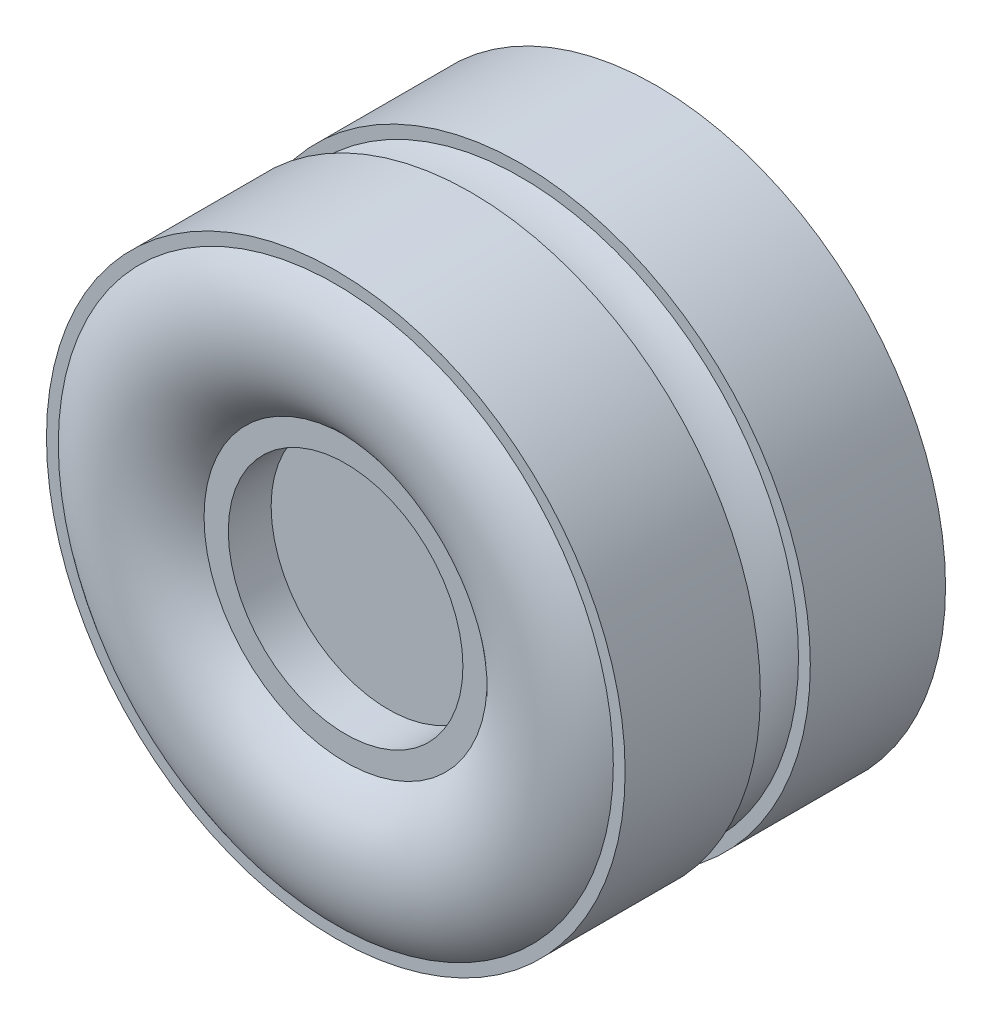
ISO-10303-21;
HEADER;
FILE_DESCRIPTION(('STEP AP214'),'2;1');
FILE_NAME('part.step','',(''),(''),'','','');
FILE_SCHEMA(('AUTOMOTIVE_DESIGN { 1 0 10303 214 1 1 1 1 }'));
ENDSEC;
DATA;
#1=APPLICATION_CONTEXT('core data for automotive mechanical design processes');
#2=APPLICATION_PROTOCOL_DEFINITION('international standard','automotive_design',2000,#1);
#3=PRODUCT_CONTEXT('',#1,'mechanical');
#4=PRODUCT('Part','Part','',(#3));
#5=PRODUCT_RELATED_PRODUCT_CATEGORY('part','',(#4));
#6=PRODUCT_DEFINITION_FORMATION('','',#4);
#7=PRODUCT_DEFINITION_CONTEXT('part definition',#1,'design');
#8=PRODUCT_DEFINITION('design','',#6,#7);
#9=PRODUCT_DEFINITION_SHAPE('','',#8);
#10=(LENGTH_UNIT() NAMED_UNIT(*) SI_UNIT(.MILLI.,.METRE.));
#11=(NAMED_UNIT(*) PLANE_ANGLE_UNIT() SI_UNIT($,.RADIAN.));
#12=(NAMED_UNIT(*) SI_UNIT($,.STERADIAN.) SOLID_ANGLE_UNIT());
#13=UNCERTAINTY_MEASURE_WITH_UNIT(LENGTH_MEASURE(1.E-05),#10,'distance_accuracy_value','');
#14=(GEOMETRIC_REPRESENTATION_CONTEXT(3) GLOBAL_UNCERTAINTY_ASSIGNED_CONTEXT((#13)) GLOBAL_UNIT_ASSIGNED_CONTEXT((#10,
#11,#12)) REPRESENTATION_CONTEXT('',''));
#15=CARTESIAN_POINT('',(0.,0.,0.));
#16=DIRECTION('',(0.,0.,1.));
#17=DIRECTION('',(1.,0.,0.));
#18=AXIS2_PLACEMENT_3D('',#15,#16,#17);
#19=CARTESIAN_POINT('',(0.,0.,-84.5961864311711));
#20=DIRECTION('',(0.,0.,-1.));
#21=DIRECTION('',(-1.,0.,0.));
#22=AXIS2_PLACEMENT_3D('',#19,#20,#21);
#23=TOROIDAL_SURFACE('',#22,94.1951945537992,43.0227364311711);
#24=CARTESIAN_POINT('',(0.,0.,-55.9087530309759));
#25=DIRECTION('',(0.,0.,-1.));
#26=DIRECTION('',(-1.,0.,0.));
#27=AXIS2_PLACEMENT_3D('',#24,#25,#26);
#28=CIRCLE('',#27,62.132957967195);
#29=CARTESIAN_POINT('',(-62.132957967195,0.,-55.9087530309759));
#30=VERTEX_POINT('',#29);
#31=EDGE_CURVE('E80',#30,#30,#28,.T.);
#32=ORIENTED_EDGE('',*,*,#31,.T.);
#33=EDGE_LOOP('',(#32));
#34=FACE_BOUND('',#33,.T.);
#35=CARTESIAN_POINT('',(0.,0.,-51.60645));
#36=DIRECTION('',(0.,0.,-1.));
#37=DIRECTION('',(-1.,0.,0.));
#38=AXIS2_PLACEMENT_3D('',#35,#36,#37);
#39=CIRCLE('',#38,121.811007781511);
#40=CARTESIAN_POINT('',(-121.811007781511,0.,-51.60645));
#41=VERTEX_POINT('',#40);
#42=EDGE_CURVE('E11',#41,#41,#39,.T.);
#43=ORIENTED_EDGE('',*,*,#42,.F.);
#44=EDGE_LOOP('',(#43));
#45=FACE_BOUND('',#44,.T.);
#46=ADVANCED_FACE('F46',(#34,#45),#23,.T.);
#47=CARTESIAN_POINT('',(0.,121.811007781511,-51.60645));
#48=DIRECTION('',(0.,0.,1.));
#49=DIRECTION('',(1.,0.,0.));
#50=AXIS2_PLACEMENT_3D('',#47,#48,#49);
#51=PLANE('',#50);
#52=ORIENTED_EDGE('',*,*,#42,.T.);
#53=EDGE_LOOP('',(#52));
#54=FACE_BOUND('',#53,.T.);
#55=CARTESIAN_POINT('',(0.,0.,-51.60645));
#56=DIRECTION('',(0.,0.,-1.));
#57=DIRECTION('',(-1.,0.,0.));
#58=AXIS2_PLACEMENT_3D('',#55,#56,#57);
#59=CIRCLE('',#58,127.);
#60=CARTESIAN_POINT('',(-127.,0.,-51.60645));
#61=VERTEX_POINT('',#60);
#62=EDGE_CURVE('E52',#61,#61,#59,.T.);
#63=ORIENTED_EDGE('',*,*,#62,.F.);
#64=EDGE_LOOP('',(#63));
#65=FACE_BOUND('',#64,.T.);
#66=ADVANCED_FACE('F98',(#54,#65),#51,.T.);
#67=CARTESIAN_POINT('',(0.,0.,-81.28));
#68=DIRECTION('',(0.,0.,-1.));
#69=DIRECTION('',(-1.,0.,0.));
#70=AXIS2_PLACEMENT_3D('',#67,#68,#69);
#71=CYLINDRICAL_SURFACE('',#70,127.);
#72=ORIENTED_EDGE('',*,*,#62,.T.);
#73=EDGE_LOOP('',(#72));
#74=FACE_BOUND('',#73,.T.);
#75=CARTESIAN_POINT('',(0.,0.,-110.95355));
#76=DIRECTION('',(0.,0.,-1.));
#77=DIRECTION('',(-1.,0.,0.));
#78=AXIS2_PLACEMENT_3D('',#75,#76,#77);
#79=CIRCLE('',#78,127.);
#80=CARTESIAN_POINT('',(-127.,0.,-110.95355));
#81=VERTEX_POINT('',#80);
#82=EDGE_CURVE('E56',#81,#81,#79,.T.);
#83=ORIENTED_EDGE('',*,*,#82,.F.);
#84=EDGE_LOOP('',(#83));
#85=FACE_BOUND('',#84,.T.);
#86=ADVANCED_FACE('F102',(#74,#85),#71,.T.);
#87=CARTESIAN_POINT('',(0.,127.,-110.95355));
#88=DIRECTION('',(0.,0.,-1.));
#89=DIRECTION('',(-1.,0.,0.));
#90=AXIS2_PLACEMENT_3D('',#87,#88,#89);
#91=PLANE('',#90);
#92=ORIENTED_EDGE('',*,*,#82,.T.);
#93=EDGE_LOOP('',(#92));
#94=FACE_BOUND('',#93,.T.);
#95=CARTESIAN_POINT('',(0.,0.,-110.95355));
#96=DIRECTION('',(0.,0.,-1.));
#97=DIRECTION('',(-1.,0.,0.));
#98=AXIS2_PLACEMENT_3D('',#95,#96,#97);
#99=CIRCLE('',#98,121.811007781511);
#100=CARTESIAN_POINT('',(-121.811007781511,0.,-110.95355));
#101=VERTEX_POINT('',#100);
#102=EDGE_CURVE('E60',#101,#101,#99,.T.);
#103=ORIENTED_EDGE('',*,*,#102,.F.);
#104=EDGE_LOOP('',(#103));
#105=FACE_BOUND('',#104,.T.);
#106=ADVANCED_FACE('F106',(#94,#105),#91,.T.);
#107=CARTESIAN_POINT('',(0.,0.,-77.963813568829));
#108=DIRECTION('',(0.,0.,-1.));
#109=DIRECTION('',(-1.,0.,0.));
#110=AXIS2_PLACEMENT_3D('',#107,#108,#109);
#111=TOROIDAL_SURFACE('',#110,94.1951945537992,43.0227364311711);
#112=ORIENTED_EDGE('',*,*,#102,.T.);
#113=EDGE_LOOP('',(#112));
#114=FACE_BOUND('',#113,.T.);
#115=CARTESIAN_POINT('',(0.,0.,-106.651246969024));
#116=DIRECTION('',(0.,0.,-1.));
#117=DIRECTION('',(-1.,0.,0.));
#118=AXIS2_PLACEMENT_3D('',#115,#116,#117);
#119=CIRCLE('',#118,62.132957967195);
#120=CARTESIAN_POINT('',(-62.132957967195,0.,-106.651246969024));
#121=VERTEX_POINT('',#120);
#122=EDGE_CURVE('E65',#121,#121,#119,.T.);
#123=ORIENTED_EDGE('',*,*,#122,.F.);
#124=EDGE_LOOP('',(#123));
#125=FACE_BOUND('',#124,.T.);
#126=ADVANCED_FACE('F112',(#114,#125),#111,.T.);
#127=CARTESIAN_POINT('',(0.,51.4886860347556,-106.651246969024));
#128=DIRECTION('',(0.,0.,-1.));
#129=DIRECTION('',(-1.,0.,0.));
#130=AXIS2_PLACEMENT_3D('',#127,#128,#129);
#131=PLANE('',#130);
#132=ORIENTED_EDGE('',*,*,#122,.T.);
#133=EDGE_LOOP('',(#132));
#134=FACE_BOUND('',#133,.T.);
#135=CARTESIAN_POINT('',(0.,0.,-106.651246969024));
#136=DIRECTION('',(0.,0.,-1.));
#137=DIRECTION('',(-1.,0.,0.));
#138=AXIS2_PLACEMENT_3D('',#135,#136,#137);
#139=CIRCLE('',#138,51.4886860347556);
#140=CARTESIAN_POINT('',(-51.4886860347556,0.,-106.651246969024));
#141=VERTEX_POINT('',#140);
#142=EDGE_CURVE('E68',#141,#141,#139,.T.);
#143=ORIENTED_EDGE('',*,*,#142,.F.);
#144=EDGE_LOOP('',(#143));
#145=FACE_BOUND('',#144,.T.);
#146=ADVANCED_FACE('F116',(#134,#145),#131,.T.);
#147=CARTESIAN_POINT('',(0.,0.,-81.28));
#148=DIRECTION('',(0.,0.,-1.));
#149=DIRECTION('',(-1.,0.,0.));
#150=AXIS2_PLACEMENT_3D('',#147,#148,#149);
#151=CYLINDRICAL_SURFACE('',#150,51.4886860347556);
#152=ORIENTED_EDGE('',*,*,#142,.T.);
#153=EDGE_LOOP('',(#152));
#154=FACE_BOUND('',#153,.T.);
#155=CARTESIAN_POINT('',(0.,0.,-88.2187004834596));
#156=DIRECTION('',(0.,0.,-1.));
#157=DIRECTION('',(-1.,0.,0.));
#158=AXIS2_PLACEMENT_3D('',#155,#156,#157);
#159=CIRCLE('',#158,51.4886860347556);
#160=CARTESIAN_POINT('',(-51.4886860347556,0.,-88.2187004834596));
#161=VERTEX_POINT('',#160);
#162=EDGE_CURVE('E71',#161,#161,#159,.T.);
#163=ORIENTED_EDGE('',*,*,#162,.F.);
#164=EDGE_LOOP('',(#163));
#165=FACE_BOUND('',#164,.T.);
#166=ADVANCED_FACE('F120',(#154,#165),#151,.F.);
#167=CARTESIAN_POINT('',(0.,0.,-88.2187004834596));
#168=DIRECTION('',(0.,0.,-1.));
#169=DIRECTION('',(-1.,0.,0.));
#170=AXIS2_PLACEMENT_3D('',#167,#168,#169);
#171=PLANE('',#170);
#172=ORIENTED_EDGE('',*,*,#162,.T.);
#173=EDGE_LOOP('',(#172));
#174=FACE_BOUND('',#173,.T.);
#175=ADVANCED_FACE('F124',(#174),#171,.T.);
#176=CARTESIAN_POINT('',(0.,51.4886860347556,-74.7145626672426));
#177=DIRECTION('',(0.,0.,1.));
#178=DIRECTION('',(1.,0.,0.));
#179=AXIS2_PLACEMENT_3D('',#176,#177,#178);
#180=PLANE('',#179);
#181=CARTESIAN_POINT('',(0.,0.,-74.714562667227));
#182=DIRECTION('',(0.,0.,-1.));
#183=DIRECTION('',(-1.,0.,0.));
#184=AXIS2_PLACEMENT_3D('',#181,#182,#183);
#185=CIRCLE('',#184,51.4886860347556);
#186=CARTESIAN_POINT('',(-51.4886860347556,0.,-74.714562667227));
#187=VERTEX_POINT('',#186);
#188=EDGE_CURVE('E74',#187,#187,#185,.T.);
#189=ORIENTED_EDGE('',*,*,#188,.F.);
#190=EDGE_LOOP('',(#189));
#191=FACE_BOUND('',#190,.T.);
#192=ADVANCED_FACE('F94',(#191),#180,.T.);
#193=CARTESIAN_POINT('',(0.,0.,-81.28));
#194=DIRECTION('',(0.,0.,-1.));
#195=DIRECTION('',(-1.,0.,0.));
#196=AXIS2_PLACEMENT_3D('',#193,#194,#195);
#197=CYLINDRICAL_SURFACE('',#196,51.4886860347556);
#198=ORIENTED_EDGE('',*,*,#188,.T.);
#199=EDGE_LOOP('',(#198));
#200=FACE_BOUND('',#199,.T.);
#201=CARTESIAN_POINT('',(0.,0.,-55.9087530309759));
#202=DIRECTION('',(0.,0.,-1.));
#203=DIRECTION('',(-1.,0.,0.));
#204=AXIS2_PLACEMENT_3D('',#201,#202,#203);
#205=CIRCLE('',#204,51.4886860347556);
#206=CARTESIAN_POINT('',(-51.4886860347556,0.,-55.9087530309759));
#207=VERTEX_POINT('',#206);
#208=EDGE_CURVE('E77',#207,#207,#205,.T.);
#209=ORIENTED_EDGE('',*,*,#208,.F.);
#210=EDGE_LOOP('',(#209));
#211=FACE_BOUND('',#210,.T.);
#212=ADVANCED_FACE('F88',(#200,#211),#197,.F.);
#213=CARTESIAN_POINT('',(0.,62.132957967195,-55.9087530309759));
#214=DIRECTION('',(0.,0.,1.));
#215=DIRECTION('',(1.,0.,0.));
#216=AXIS2_PLACEMENT_3D('',#213,#214,#215);
#217=PLANE('',#216);
#218=ORIENTED_EDGE('',*,*,#208,.T.);
#219=EDGE_LOOP('',(#218));
#220=FACE_BOUND('',#219,.T.);
#221=ORIENTED_EDGE('',*,*,#31,.F.);
#222=EDGE_LOOP('',(#221));
#223=FACE_BOUND('',#222,.T.);
#224=ADVANCED_FACE('F86',(#220,#223),#217,.T.);
#225=CLOSED_SHELL('',(#46,#66,#86,#106,#126,#146,#166,#175,#192,#212,#224));
#226=MANIFOLD_SOLID_BREP('B2',#225);
#227=CARTESIAN_POINT('',(0.,0.,-3.31618643117106));
#228=DIRECTION('',(0.,0.,-1.));
#229=DIRECTION('',(-1.,0.,0.));
#230=AXIS2_PLACEMENT_3D('',#227,#228,#229);
#231=TOROIDAL_SURFACE('',#230,94.1951945537992,43.0227364311711);
#232=CARTESIAN_POINT('',(0.,0.,25.3712469690241));
#233=DIRECTION('',(0.,0.,-1.));
#234=DIRECTION('',(-1.,0.,0.));
#235=AXIS2_PLACEMENT_3D('',#232,#233,#234);
#236=CIRCLE('',#235,62.132957967195);
#237=CARTESIAN_POINT('',(-62.132957967195,0.,25.3712469690241));
#238=VERTEX_POINT('',#237);
#239=EDGE_CURVE('E240',#238,#238,#236,.T.);
#240=ORIENTED_EDGE('',*,*,#239,.T.);
#241=EDGE_LOOP('',(#240));
#242=FACE_BOUND('',#241,.T.);
#243=CARTESIAN_POINT('',(0.,0.,29.67355));
#244=DIRECTION('',(0.,0.,-1.));
#245=DIRECTION('',(-1.,0.,0.));
#246=AXIS2_PLACEMENT_3D('',#243,#244,#245);
#247=CIRCLE('',#246,121.811007781511);
#248=CARTESIAN_POINT('',(-121.811007781511,0.,29.67355));
#249=VERTEX_POINT('',#248);
#250=EDGE_CURVE('E45',#249,#249,#247,.T.);
#251=ORIENTED_EDGE('',*,*,#250,.F.);
#252=EDGE_LOOP('',(#251));
#253=FACE_BOUND('',#252,.T.);
#254=ADVANCED_FACE('F206',(#242,#253),#231,.T.);
#255=CARTESIAN_POINT('',(0.,121.811007781511,29.67355));
#256=DIRECTION('',(0.,0.,1.));
#257=DIRECTION('',(1.,0.,0.));
#258=AXIS2_PLACEMENT_3D('',#255,#256,#257);
#259=PLANE('',#258);
#260=ORIENTED_EDGE('',*,*,#250,.T.);
#261=EDGE_LOOP('',(#260));
#262=FACE_BOUND('',#261,.T.);
#263=CARTESIAN_POINT('',(0.,0.,29.67355));
#264=DIRECTION('',(0.,0.,-1.));
#265=DIRECTION('',(-1.,0.,0.));
#266=AXIS2_PLACEMENT_3D('',#263,#264,#265);
#267=CIRCLE('',#266,127.);
#268=CARTESIAN_POINT('',(-127.,0.,29.67355));
#269=VERTEX_POINT('',#268);
#270=EDGE_CURVE('E212',#269,#269,#267,.T.);
#271=ORIENTED_EDGE('',*,*,#270,.F.);
#272=EDGE_LOOP('',(#271));
#273=FACE_BOUND('',#272,.T.);
#274=ADVANCED_FACE('F258',(#262,#273),#259,.T.);
#275=CARTESIAN_POINT('',(0.,0.,0.));
#276=DIRECTION('',(0.,0.,-1.));
#277=DIRECTION('',(-1.,0.,0.));
#278=AXIS2_PLACEMENT_3D('',#275,#276,#277);
#279=CYLINDRICAL_SURFACE('',#278,127.);
#280=ORIENTED_EDGE('',*,*,#270,.T.);
#281=EDGE_LOOP('',(#280));
#282=FACE_BOUND('',#281,.T.);
#283=CARTESIAN_POINT('',(0.,0.,-29.67355));
#284=DIRECTION('',(0.,0.,-1.));
#285=DIRECTION('',(-1.,0.,0.));
#286=AXIS2_PLACEMENT_3D('',#283,#284,#285);
#287=CIRCLE('',#286,127.);
#288=CARTESIAN_POINT('',(-127.,0.,-29.67355));
#289=VERTEX_POINT('',#288);
#290=EDGE_CURVE('E216',#289,#289,#287,.T.);
#291=ORIENTED_EDGE('',*,*,#290,.F.);
#292=EDGE_LOOP('',(#291));
#293=FACE_BOUND('',#292,.T.);
#294=ADVANCED_FACE('F262',(#282,#293),#279,.T.);
#295=CARTESIAN_POINT('',(0.,127.,-29.67355));
#296=DIRECTION('',(0.,0.,-1.));
#297=DIRECTION('',(-1.,0.,0.));
#298=AXIS2_PLACEMENT_3D('',#295,#296,#297);
#299=PLANE('',#298);
#300=ORIENTED_EDGE('',*,*,#290,.T.);
#301=EDGE_LOOP('',(#300));
#302=FACE_BOUND('',#301,.T.);
#303=CARTESIAN_POINT('',(0.,0.,-29.67355));
#304=DIRECTION('',(0.,0.,-1.));
#305=DIRECTION('',(-1.,0.,0.));
#306=AXIS2_PLACEMENT_3D('',#303,#304,#305);
#307=CIRCLE('',#306,121.811007781511);
#308=CARTESIAN_POINT('',(-121.811007781511,0.,-29.67355));
#309=VERTEX_POINT('',#308);
#310=EDGE_CURVE('E220',#309,#309,#307,.T.);
#311=ORIENTED_EDGE('',*,*,#310,.F.);
#312=EDGE_LOOP('',(#311));
#313=FACE_BOUND('',#312,.T.);
#314=ADVANCED_FACE('F266',(#302,#313),#299,.T.);
#315=CARTESIAN_POINT('',(0.,0.,3.31618643117106));
#316=DIRECTION('',(0.,0.,-1.));
#317=DIRECTION('',(-1.,0.,0.));
#318=AXIS2_PLACEMENT_3D('',#315,#316,#317);
#319=TOROIDAL_SURFACE('',#318,94.1951945537992,43.0227364311711);
#320=ORIENTED_EDGE('',*,*,#310,.T.);
#321=EDGE_LOOP('',(#320));
#322=FACE_BOUND('',#321,.T.);
#323=CARTESIAN_POINT('',(0.,0.,-25.3712469690241));
#324=DIRECTION('',(0.,0.,-1.));
#325=DIRECTION('',(-1.,0.,0.));
#326=AXIS2_PLACEMENT_3D('',#323,#324,#325);
#327=CIRCLE('',#326,62.132957967195);
#328=CARTESIAN_POINT('',(-62.132957967195,0.,-25.3712469690241));
#329=VERTEX_POINT('',#328);
#330=EDGE_CURVE('E225',#329,#329,#327,.T.);
#331=ORIENTED_EDGE('',*,*,#330,.F.);
#332=EDGE_LOOP('',(#331));
#333=FACE_BOUND('',#332,.T.);
#334=ADVANCED_FACE('F272',(#322,#333),#319,.T.);
#335=CARTESIAN_POINT('',(0.,51.4886860347556,-25.3712469690241));
#336=DIRECTION('',(0.,0.,-1.));
#337=DIRECTION('',(-1.,0.,0.));
#338=AXIS2_PLACEMENT_3D('',#335,#336,#337);
#339=PLANE('',#338);
#340=ORIENTED_EDGE('',*,*,#330,.T.);
#341=EDGE_LOOP('',(#340));
#342=FACE_BOUND('',#341,.T.);
#343=CARTESIAN_POINT('',(0.,0.,-25.3712469690241));
#344=DIRECTION('',(0.,0.,-1.));
#345=DIRECTION('',(-1.,0.,0.));
#346=AXIS2_PLACEMENT_3D('',#343,#344,#345);
#347=CIRCLE('',#346,51.4886860347556);
#348=CARTESIAN_POINT('',(-51.4886860347556,0.,-25.3712469690241));
#349=VERTEX_POINT('',#348);
#350=EDGE_CURVE('E228',#349,#349,#347,.T.);
#351=ORIENTED_EDGE('',*,*,#350,.F.);
#352=EDGE_LOOP('',(#351));
#353=FACE_BOUND('',#352,.T.);
#354=ADVANCED_FACE('F276',(#342,#353),#339,.T.);
#355=CARTESIAN_POINT('',(0.,0.,0.));
#356=DIRECTION('',(0.,0.,-1.));
#357=DIRECTION('',(-1.,0.,0.));
#358=AXIS2_PLACEMENT_3D('',#355,#356,#357);
#359=CYLINDRICAL_SURFACE('',#358,51.4886860347556);
#360=ORIENTED_EDGE('',*,*,#350,.T.);
#361=EDGE_LOOP('',(#360));
#362=FACE_BOUND('',#361,.T.);
#363=CARTESIAN_POINT('',(0.,0.,-6.93870048345957));
#364=DIRECTION('',(0.,0.,-1.));
#365=DIRECTION('',(-1.,0.,0.));
#366=AXIS2_PLACEMENT_3D('',#363,#364,#365);
#367=CIRCLE('',#366,51.4886860347556);
#368=CARTESIAN_POINT('',(-51.4886860347556,0.,-6.93870048345957));
#369=VERTEX_POINT('',#368);
#370=EDGE_CURVE('E231',#369,#369,#367,.T.);
#371=ORIENTED_EDGE('',*,*,#370,.F.);
#372=EDGE_LOOP('',(#371));
#373=FACE_BOUND('',#372,.T.);
#374=ADVANCED_FACE('F280',(#362,#373),#359,.F.);
#375=CARTESIAN_POINT('',(0.,0.,-6.93870048345957));
#376=DIRECTION('',(0.,0.,-1.));
#377=DIRECTION('',(-1.,0.,0.));
#378=AXIS2_PLACEMENT_3D('',#375,#376,#377);
#379=PLANE('',#378);
#380=ORIENTED_EDGE('',*,*,#370,.T.);
#381=EDGE_LOOP('',(#380));
#382=FACE_BOUND('',#381,.T.);
#383=ADVANCED_FACE('F284',(#382),#379,.T.);
#384=CARTESIAN_POINT('',(0.,51.4886860347556,6.56543733275741));
#385=DIRECTION('',(0.,0.,1.));
#386=DIRECTION('',(1.,0.,0.));
#387=AXIS2_PLACEMENT_3D('',#384,#385,#386);
#388=PLANE('',#387);
#389=CARTESIAN_POINT('',(0.,0.,6.565437332773));
#390=DIRECTION('',(0.,0.,-1.));
#391=DIRECTION('',(-1.,0.,0.));
#392=AXIS2_PLACEMENT_3D('',#389,#390,#391);
#393=CIRCLE('',#392,51.4886860347556);
#394=CARTESIAN_POINT('',(-51.4886860347556,0.,6.565437332773));
#395=VERTEX_POINT('',#394);
#396=EDGE_CURVE('E234',#395,#395,#393,.T.);
#397=ORIENTED_EDGE('',*,*,#396,.F.);
#398=EDGE_LOOP('',(#397));
#399=FACE_BOUND('',#398,.T.);
#400=ADVANCED_FACE('F254',(#399),#388,.T.);
#401=CARTESIAN_POINT('',(0.,0.,0.));
#402=DIRECTION('',(0.,0.,-1.));
#403=DIRECTION('',(-1.,0.,0.));
#404=AXIS2_PLACEMENT_3D('',#401,#402,#403);
#405=CYLINDRICAL_SURFACE('',#404,51.4886860347556);
#406=ORIENTED_EDGE('',*,*,#396,.T.);
#407=EDGE_LOOP('',(#406));
#408=FACE_BOUND('',#407,.T.);
#409=CARTESIAN_POINT('',(0.,0.,25.3712469690241));
#410=DIRECTION('',(0.,0.,-1.));
#411=DIRECTION('',(-1.,0.,0.));
#412=AXIS2_PLACEMENT_3D('',#409,#410,#411);
#413=CIRCLE('',#412,51.4886860347556);
#414=CARTESIAN_POINT('',(-51.4886860347556,0.,25.3712469690241));
#415=VERTEX_POINT('',#414);
#416=EDGE_CURVE('E237',#415,#415,#413,.T.);
#417=ORIENTED_EDGE('',*,*,#416,.F.);
#418=EDGE_LOOP('',(#417));
#419=FACE_BOUND('',#418,.T.);
#420=ADVANCED_FACE('F248',(#408,#419),#405,.F.);
#421=CARTESIAN_POINT('',(0.,62.132957967195,25.3712469690241));
#422=DIRECTION('',(0.,0.,1.));
#423=DIRECTION('',(1.,0.,0.));
#424=AXIS2_PLACEMENT_3D('',#421,#422,#423);
#425=PLANE('',#424);
#426=ORIENTED_EDGE('',*,*,#416,.T.);
#427=EDGE_LOOP('',(#426));
#428=FACE_BOUND('',#427,.T.);
#429=ORIENTED_EDGE('',*,*,#239,.F.);
#430=EDGE_LOOP('',(#429));
#431=FACE_BOUND('',#430,.T.);
#432=ADVANCED_FACE('F246',(#428,#431),#425,.T.);
#433=CLOSED_SHELL('',(#254,#274,#294,#314,#334,#354,#374,#383,#400,#420,#432));
#434=MANIFOLD_SOLID_BREP('B6',#433);
#435=ADVANCED_BREP_SHAPE_REPRESENTATION('',(#18,#226,#434),#14);
#436=SHAPE_DEFINITION_REPRESENTATION(#9,#435);
ENDSEC;
END-ISO-10303-21;
